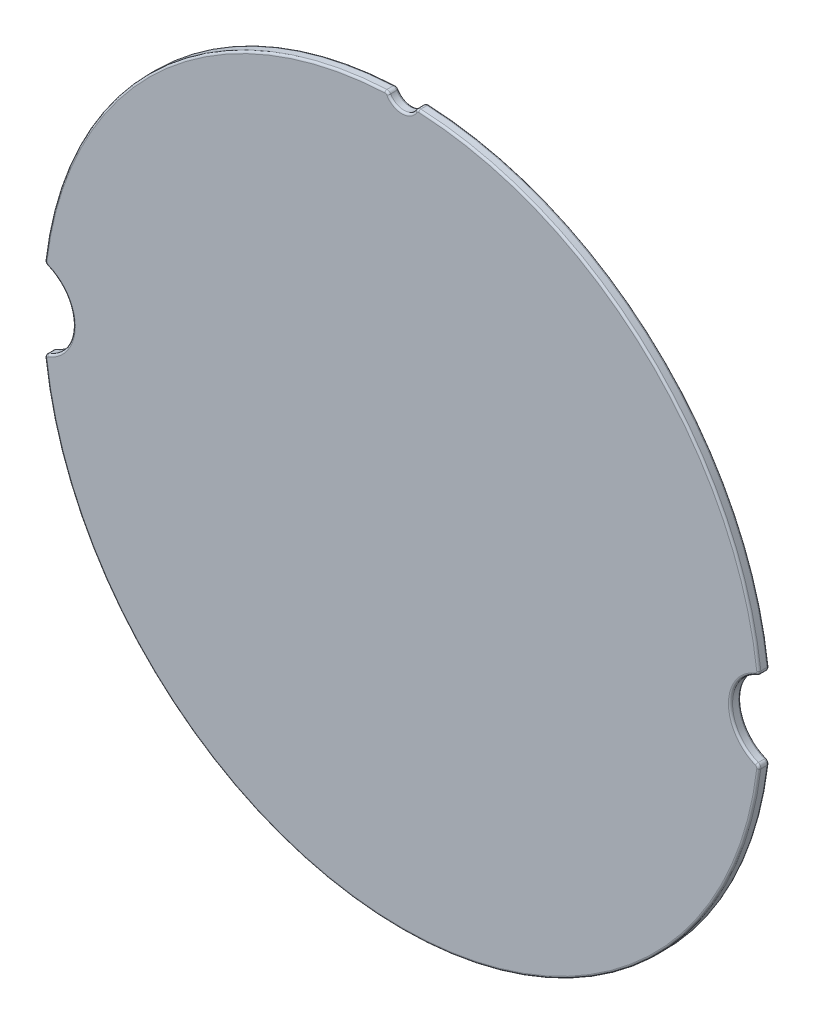
ISO-10303-21;
HEADER;
FILE_DESCRIPTION(('STEP AP214'),'2;1');
FILE_NAME('part.step','',(''),(''),'','','');
FILE_SCHEMA(('AUTOMOTIVE_DESIGN { 1 0 10303 214 1 1 1 1 }'));
ENDSEC;
DATA;
#1=APPLICATION_CONTEXT('core data for automotive mechanical design processes');
#2=APPLICATION_PROTOCOL_DEFINITION('international standard','automotive_design',2000,#1);
#3=PRODUCT_CONTEXT('',#1,'mechanical');
#4=PRODUCT('Part','Part','',(#3));
#5=PRODUCT_RELATED_PRODUCT_CATEGORY('part','',(#4));
#6=PRODUCT_DEFINITION_FORMATION('','',#4);
#7=PRODUCT_DEFINITION_CONTEXT('part definition',#1,'design');
#8=PRODUCT_DEFINITION('design','',#6,#7);
#9=PRODUCT_DEFINITION_SHAPE('','',#8);
#10=(LENGTH_UNIT() NAMED_UNIT(*) SI_UNIT(.MILLI.,.METRE.));
#11=(NAMED_UNIT(*) PLANE_ANGLE_UNIT() SI_UNIT($,.RADIAN.));
#12=(NAMED_UNIT(*) SI_UNIT($,.STERADIAN.) SOLID_ANGLE_UNIT());
#13=UNCERTAINTY_MEASURE_WITH_UNIT(LENGTH_MEASURE(1.E-05),#10,'distance_accuracy_value','');
#14=(GEOMETRIC_REPRESENTATION_CONTEXT(3) GLOBAL_UNCERTAINTY_ASSIGNED_CONTEXT((#13)) GLOBAL_UNIT_ASSIGNED_CONTEXT((#10,
#11,#12)) REPRESENTATION_CONTEXT('',''));
#15=CARTESIAN_POINT('',(0.,0.,0.));
#16=DIRECTION('',(0.,0.,1.));
#17=DIRECTION('',(1.,0.,0.));
#18=AXIS2_PLACEMENT_3D('',#15,#16,#17);
#19=CARTESIAN_POINT('',(0.,0.,-13.5));
#20=DIRECTION('',(0.,0.,1.));
#21=DIRECTION('',(1.,0.,0.));
#22=AXIS2_PLACEMENT_3D('',#19,#20,#21);
#23=CYLINDRICAL_SURFACE('',#22,17.5);
#24=DIRECTION('',(0.,0.,1.));
#25=VECTOR('',#24,1.);
#26=CARTESIAN_POINT('',(0.826653793135384,17.480464625012,-13.5));
#27=LINE('',#26,#25);
#28=CARTESIAN_POINT('',(0.826653793135384,17.480464625012,-13.4));
#29=VERTEX_POINT('',#28);
#30=CARTESIAN_POINT('',(0.826653793135384,17.480464625012,-13.1));
#31=VERTEX_POINT('',#30);
#32=EDGE_CURVE('E271',#29,#31,#27,.T.);
#33=ORIENTED_EDGE('',*,*,#32,.T.);
#34=CARTESIAN_POINT('',(0.,0.,-13.1));
#35=DIRECTION('',(0.,0.,1.));
#36=DIRECTION('',(1.,0.,0.));
#37=AXIS2_PLACEMENT_3D('',#34,#35,#36);
#38=CIRCLE('',#37,17.5);
#39=CARTESIAN_POINT('',(17.3777697495183,2.0647320728672,-13.1));
#40=VERTEX_POINT('',#39);
#41=EDGE_CURVE('E414',#31,#40,#38,.F.);
#42=ORIENTED_EDGE('',*,*,#41,.T.);
#43=DIRECTION('',(0.,0.,1.));
#44=VECTOR('',#43,1.);
#45=CARTESIAN_POINT('',(17.3777697495183,2.0647320728672,-13.5));
#46=LINE('',#45,#44);
#47=CARTESIAN_POINT('',(17.3777697495183,2.0647320728672,-13.4));
#48=VERTEX_POINT('',#47);
#49=EDGE_CURVE('E261',#48,#40,#46,.T.);
#50=ORIENTED_EDGE('',*,*,#49,.F.);
#51=CARTESIAN_POINT('',(0.,0.,-13.4));
#52=DIRECTION('',(0.,0.,1.));
#53=DIRECTION('',(1.,0.,0.));
#54=AXIS2_PLACEMENT_3D('',#51,#52,#53);
#55=CIRCLE('',#54,17.5);
#56=EDGE_CURVE('E311',#48,#29,#55,.T.);
#57=ORIENTED_EDGE('',*,*,#56,.T.);
#58=EDGE_LOOP('',(#33,#42,#50,#57));
#59=FACE_BOUND('',#58,.T.);
#60=ADVANCED_FACE('F41',(#59),#23,.T.);
#61=CARTESIAN_POINT('',(17.1791666666667,2.04113513489157,-13.5));
#62=DIRECTION('',(0.,0.,1.));
#63=DIRECTION('',(1.,0.,0.));
#64=AXIS2_PLACEMENT_3D('',#61,#62,#63);
#65=CYLINDRICAL_SURFACE('',#64,0.200000000000002);
#66=ORIENTED_EDGE('',*,*,#49,.T.);
#67=CARTESIAN_POINT('',(17.1791666666667,2.04113513489157,-13.1));
#68=DIRECTION('',(0.,0.,1.));
#69=DIRECTION('',(1.,0.,0.));
#70=AXIS2_PLACEMENT_3D('',#67,#68,#69);
#71=CIRCLE('',#70,0.200000000000002);
#72=CARTESIAN_POINT('',(17.2537878787879,1.85557739535598,-13.1));
#73=VERTEX_POINT('',#72);
#74=EDGE_CURVE('E408',#40,#73,#71,.F.);
#75=ORIENTED_EDGE('',*,*,#74,.T.);
#76=DIRECTION('',(0.,0.,1.));
#77=VECTOR('',#76,1.);
#78=CARTESIAN_POINT('',(17.2537878787879,1.85557739535598,-13.5));
#79=LINE('',#78,#77);
#80=CARTESIAN_POINT('',(17.2537878787879,1.85557739535598,-13.4));
#81=VERTEX_POINT('',#80);
#82=EDGE_CURVE('E268',#81,#73,#79,.T.);
#83=ORIENTED_EDGE('',*,*,#82,.F.);
#84=CARTESIAN_POINT('',(17.1791666666667,2.04113513489157,-13.4));
#85=DIRECTION('',(0.,0.,1.));
#86=DIRECTION('',(1.,0.,0.));
#87=AXIS2_PLACEMENT_3D('',#84,#85,#86);
#88=CIRCLE('',#87,0.200000000000002);
#89=EDGE_CURVE('E305',#81,#48,#88,.T.);
#90=ORIENTED_EDGE('',*,*,#89,.T.);
#91=EDGE_LOOP('',(#66,#75,#83,#90));
#92=FACE_BOUND('',#91,.T.);
#93=ADVANCED_FACE('F472',(#92),#65,.T.);
#94=CARTESIAN_POINT('',(18.,0.,-13.5));
#95=DIRECTION('',(0.,0.,1.));
#96=DIRECTION('',(1.,0.,0.));
#97=AXIS2_PLACEMENT_3D('',#94,#95,#96);
#98=CYLINDRICAL_SURFACE('',#97,2.);
#99=ORIENTED_EDGE('',*,*,#82,.T.);
#100=CARTESIAN_POINT('',(18.,0.,-13.1));
#101=DIRECTION('',(0.,0.,1.));
#102=DIRECTION('',(1.,0.,0.));
#103=AXIS2_PLACEMENT_3D('',#100,#101,#102);
#104=CIRCLE('',#103,2.);
#105=CARTESIAN_POINT('',(17.2537878787879,-1.85557739535597,-13.1));
#106=VERTEX_POINT('',#105);
#107=EDGE_CURVE('E402',#73,#106,#104,.T.);
#108=ORIENTED_EDGE('',*,*,#107,.T.);
#109=DIRECTION('',(0.,0.,1.));
#110=VECTOR('',#109,1.);
#111=CARTESIAN_POINT('',(17.2537878787879,-1.85557739535597,-13.5));
#112=LINE('',#111,#110);
#113=CARTESIAN_POINT('',(17.2537878787879,-1.85557739535597,-13.4));
#114=VERTEX_POINT('',#113);
#115=EDGE_CURVE('E529',#114,#106,#112,.T.);
#116=ORIENTED_EDGE('',*,*,#115,.F.);
#117=CARTESIAN_POINT('',(18.,0.,-13.4));
#118=DIRECTION('',(0.,0.,1.));
#119=DIRECTION('',(1.,0.,0.));
#120=AXIS2_PLACEMENT_3D('',#117,#118,#119);
#121=CIRCLE('',#120,2.);
#122=EDGE_CURVE('E233',#114,#81,#121,.F.);
#123=ORIENTED_EDGE('',*,*,#122,.T.);
#124=EDGE_LOOP('',(#99,#108,#116,#123));
#125=FACE_BOUND('',#124,.T.);
#126=ADVANCED_FACE('F535',(#125),#98,.F.);
#127=CARTESIAN_POINT('',(17.1791666666667,-2.04113513489157,-13.5));
#128=DIRECTION('',(0.,0.,1.));
#129=DIRECTION('',(1.,0.,0.));
#130=AXIS2_PLACEMENT_3D('',#127,#128,#129);
#131=CYLINDRICAL_SURFACE('',#130,0.200000000000002);
#132=ORIENTED_EDGE('',*,*,#115,.T.);
#133=CARTESIAN_POINT('',(17.1791666666667,-2.04113513489157,-13.1));
#134=DIRECTION('',(0.,0.,1.));
#135=DIRECTION('',(1.,0.,0.));
#136=AXIS2_PLACEMENT_3D('',#133,#134,#135);
#137=CIRCLE('',#136,0.200000000000002);
#138=CARTESIAN_POINT('',(17.3777697495183,-2.0647320728672,-13.1));
#139=VERTEX_POINT('',#138);
#140=EDGE_CURVE('E397',#106,#139,#137,.F.);
#141=ORIENTED_EDGE('',*,*,#140,.T.);
#142=DIRECTION('',(0.,0.,1.));
#143=VECTOR('',#142,1.);
#144=CARTESIAN_POINT('',(17.3777697495183,-2.0647320728672,-13.5));
#145=LINE('',#144,#143);
#146=CARTESIAN_POINT('',(17.3777697495183,-2.0647320728672,-13.4));
#147=VERTEX_POINT('',#146);
#148=EDGE_CURVE('E245',#147,#139,#145,.T.);
#149=ORIENTED_EDGE('',*,*,#148,.F.);
#150=CARTESIAN_POINT('',(17.1791666666667,-2.04113513489157,-13.4));
#151=DIRECTION('',(0.,0.,1.));
#152=DIRECTION('',(1.,0.,0.));
#153=AXIS2_PLACEMENT_3D('',#150,#151,#152);
#154=CIRCLE('',#153,0.200000000000002);
#155=EDGE_CURVE('E234',#147,#114,#154,.T.);
#156=ORIENTED_EDGE('',*,*,#155,.T.);
#157=EDGE_LOOP('',(#132,#141,#149,#156));
#158=FACE_BOUND('',#157,.T.);
#159=ADVANCED_FACE('F551',(#158),#131,.T.);
#160=CARTESIAN_POINT('',(0.,0.,-13.5));
#161=DIRECTION('',(0.,0.,1.));
#162=DIRECTION('',(1.,0.,0.));
#163=AXIS2_PLACEMENT_3D('',#160,#161,#162);
#164=CYLINDRICAL_SURFACE('',#163,17.5);
#165=ORIENTED_EDGE('',*,*,#148,.T.);
#166=CARTESIAN_POINT('',(0.,0.,-13.1));
#167=DIRECTION('',(0.,0.,1.));
#168=DIRECTION('',(1.,0.,0.));
#169=AXIS2_PLACEMENT_3D('',#166,#167,#168);
#170=CIRCLE('',#169,17.5);
#171=CARTESIAN_POINT('',(-17.3777697495183,-2.0647320728672,-13.1));
#172=VERTEX_POINT('',#171);
#173=EDGE_CURVE('E244',#139,#172,#170,.F.);
#174=ORIENTED_EDGE('',*,*,#173,.T.);
#175=DIRECTION('',(0.,0.,1.));
#176=VECTOR('',#175,1.);
#177=CARTESIAN_POINT('',(-17.3777697495183,-2.0647320728672,-13.5));
#178=LINE('',#177,#176);
#179=CARTESIAN_POINT('',(-17.3777697495183,-2.0647320728672,-13.4));
#180=VERTEX_POINT('',#179);
#181=EDGE_CURVE('E225',#180,#172,#178,.T.);
#182=ORIENTED_EDGE('',*,*,#181,.F.);
#183=CARTESIAN_POINT('',(0.,0.,-13.4));
#184=DIRECTION('',(0.,0.,1.));
#185=DIRECTION('',(1.,0.,0.));
#186=AXIS2_PLACEMENT_3D('',#183,#184,#185);
#187=CIRCLE('',#186,17.5);
#188=EDGE_CURVE('E241',#180,#147,#187,.T.);
#189=ORIENTED_EDGE('',*,*,#188,.T.);
#190=EDGE_LOOP('',(#165,#174,#182,#189));
#191=FACE_BOUND('',#190,.T.);
#192=ADVANCED_FACE('F239',(#191),#164,.T.);
#193=CARTESIAN_POINT('',(-17.1791666666667,-2.04113513489158,-13.5));
#194=DIRECTION('',(0.,0.,1.));
#195=DIRECTION('',(1.,0.,0.));
#196=AXIS2_PLACEMENT_3D('',#193,#194,#195);
#197=CYLINDRICAL_SURFACE('',#196,0.200000000000002);
#198=ORIENTED_EDGE('',*,*,#181,.T.);
#199=CARTESIAN_POINT('',(-17.1791666666667,-2.04113513489158,-13.1));
#200=DIRECTION('',(0.,0.,1.));
#201=DIRECTION('',(1.,0.,0.));
#202=AXIS2_PLACEMENT_3D('',#199,#200,#201);
#203=CIRCLE('',#202,0.200000000000002);
#204=CARTESIAN_POINT('',(-17.2537878787879,-1.85557739535598,-13.1));
#205=VERTEX_POINT('',#204);
#206=EDGE_CURVE('E391',#172,#205,#203,.F.);
#207=ORIENTED_EDGE('',*,*,#206,.T.);
#208=DIRECTION('',(0.,0.,1.));
#209=VECTOR('',#208,1.);
#210=CARTESIAN_POINT('',(-17.2537878787879,-1.85557739535598,-13.5));
#211=LINE('',#210,#209);
#212=CARTESIAN_POINT('',(-17.2537878787879,-1.85557739535598,-13.4));
#213=VERTEX_POINT('',#212);
#214=EDGE_CURVE('E228',#213,#205,#211,.T.);
#215=ORIENTED_EDGE('',*,*,#214,.F.);
#216=CARTESIAN_POINT('',(-17.1791666666667,-2.04113513489158,-13.4));
#217=DIRECTION('',(0.,0.,1.));
#218=DIRECTION('',(1.,0.,0.));
#219=AXIS2_PLACEMENT_3D('',#216,#217,#218);
#220=CIRCLE('',#219,0.200000000000002);
#221=EDGE_CURVE('E221',#213,#180,#220,.T.);
#222=ORIENTED_EDGE('',*,*,#221,.T.);
#223=EDGE_LOOP('',(#198,#207,#215,#222));
#224=FACE_BOUND('',#223,.T.);
#225=ADVANCED_FACE('F223',(#224),#197,.T.);
#226=CARTESIAN_POINT('',(-18.,0.,-13.5));
#227=DIRECTION('',(0.,0.,1.));
#228=DIRECTION('',(1.,0.,0.));
#229=AXIS2_PLACEMENT_3D('',#226,#227,#228);
#230=CYLINDRICAL_SURFACE('',#229,2.);
#231=ORIENTED_EDGE('',*,*,#214,.T.);
#232=CARTESIAN_POINT('',(-18.,0.,-13.1));
#233=DIRECTION('',(0.,0.,1.));
#234=DIRECTION('',(1.,0.,0.));
#235=AXIS2_PLACEMENT_3D('',#232,#233,#234);
#236=CIRCLE('',#235,2.);
#237=CARTESIAN_POINT('',(-17.2537878787879,1.85557739535597,-13.1));
#238=VERTEX_POINT('',#237);
#239=EDGE_CURVE('E394',#205,#238,#236,.T.);
#240=ORIENTED_EDGE('',*,*,#239,.T.);
#241=DIRECTION('',(0.,0.,1.));
#242=VECTOR('',#241,1.);
#243=CARTESIAN_POINT('',(-17.2537878787879,1.85557739535597,-13.5));
#244=LINE('',#243,#242);
#245=CARTESIAN_POINT('',(-17.2537878787879,1.85557739535597,-13.4));
#246=VERTEX_POINT('',#245);
#247=EDGE_CURVE('E523',#246,#238,#244,.T.);
#248=ORIENTED_EDGE('',*,*,#247,.F.);
#249=CARTESIAN_POINT('',(-18.,0.,-13.4));
#250=DIRECTION('',(0.,0.,1.));
#251=DIRECTION('',(1.,0.,0.));
#252=AXIS2_PLACEMENT_3D('',#249,#250,#251);
#253=CIRCLE('',#252,2.);
#254=EDGE_CURVE('E302',#246,#213,#253,.F.);
#255=ORIENTED_EDGE('',*,*,#254,.T.);
#256=EDGE_LOOP('',(#231,#240,#248,#255));
#257=FACE_BOUND('',#256,.T.);
#258=ADVANCED_FACE('F582',(#257),#230,.F.);
#259=CARTESIAN_POINT('',(-17.1791666666667,2.04113513489157,-13.5));
#260=DIRECTION('',(0.,0.,1.));
#261=DIRECTION('',(1.,0.,0.));
#262=AXIS2_PLACEMENT_3D('',#259,#260,#261);
#263=CYLINDRICAL_SURFACE('',#262,0.200000000000002);
#264=ORIENTED_EDGE('',*,*,#247,.T.);
#265=CARTESIAN_POINT('',(-17.1791666666667,2.04113513489157,-13.1));
#266=DIRECTION('',(0.,0.,1.));
#267=DIRECTION('',(1.,0.,0.));
#268=AXIS2_PLACEMENT_3D('',#265,#266,#267);
#269=CIRCLE('',#268,0.200000000000002);
#270=CARTESIAN_POINT('',(-17.3777697495183,2.0647320728672,-13.1));
#271=VERTEX_POINT('',#270);
#272=EDGE_CURVE('E399',#238,#271,#269,.F.);
#273=ORIENTED_EDGE('',*,*,#272,.T.);
#274=DIRECTION('',(0.,0.,1.));
#275=VECTOR('',#274,1.);
#276=CARTESIAN_POINT('',(-17.3777697495183,2.0647320728672,-13.5));
#277=LINE('',#276,#275);
#278=CARTESIAN_POINT('',(-17.3777697495183,2.0647320728672,-13.4));
#279=VERTEX_POINT('',#278);
#280=EDGE_CURVE('E518',#279,#271,#277,.T.);
#281=ORIENTED_EDGE('',*,*,#280,.F.);
#282=CARTESIAN_POINT('',(-17.1791666666667,2.04113513489157,-13.4));
#283=DIRECTION('',(0.,0.,1.));
#284=DIRECTION('',(1.,0.,0.));
#285=AXIS2_PLACEMENT_3D('',#282,#283,#284);
#286=CIRCLE('',#285,0.200000000000002);
#287=EDGE_CURVE('E308',#279,#246,#286,.T.);
#288=ORIENTED_EDGE('',*,*,#287,.T.);
#289=EDGE_LOOP('',(#264,#273,#281,#288));
#290=FACE_BOUND('',#289,.T.);
#291=ADVANCED_FACE('F578',(#290),#263,.T.);
#292=CARTESIAN_POINT('',(0.,0.,-13.5));
#293=DIRECTION('',(0.,0.,1.));
#294=DIRECTION('',(1.,0.,0.));
#295=AXIS2_PLACEMENT_3D('',#292,#293,#294);
#296=CYLINDRICAL_SURFACE('',#295,17.5);
#297=ORIENTED_EDGE('',*,*,#280,.T.);
#298=CARTESIAN_POINT('',(0.,0.,-13.1));
#299=DIRECTION('',(0.,0.,1.));
#300=DIRECTION('',(1.,0.,0.));
#301=AXIS2_PLACEMENT_3D('',#298,#299,#300);
#302=CIRCLE('',#301,17.5);
#303=CARTESIAN_POINT('',(-0.826653793135391,17.480464625012,-13.1));
#304=VERTEX_POINT('',#303);
#305=EDGE_CURVE('E405',#271,#304,#302,.F.);
#306=ORIENTED_EDGE('',*,*,#305,.T.);
#307=DIRECTION('',(0.,0.,1.));
#308=VECTOR('',#307,1.);
#309=CARTESIAN_POINT('',(-0.826653793135391,17.480464625012,-13.5));
#310=LINE('',#309,#308);
#311=CARTESIAN_POINT('',(-0.826653793135391,17.480464625012,-13.4));
#312=VERTEX_POINT('',#311);
#313=EDGE_CURVE('E515',#312,#304,#310,.T.);
#314=ORIENTED_EDGE('',*,*,#313,.F.);
#315=CARTESIAN_POINT('',(0.,0.,-13.4));
#316=DIRECTION('',(0.,0.,1.));
#317=DIRECTION('',(1.,0.,0.));
#318=AXIS2_PLACEMENT_3D('',#315,#316,#317);
#319=CIRCLE('',#318,17.5);
#320=EDGE_CURVE('E314',#312,#279,#319,.T.);
#321=ORIENTED_EDGE('',*,*,#320,.T.);
#322=EDGE_LOOP('',(#297,#306,#314,#321));
#323=FACE_BOUND('',#322,.T.);
#324=ADVANCED_FACE('F575',(#323),#296,.T.);
#325=CARTESIAN_POINT('',(-0.817206321213843,17.2806878864404,-13.5));
#326=DIRECTION('',(0.,0.,1.));
#327=DIRECTION('',(1.,0.,0.));
#328=AXIS2_PLACEMENT_3D('',#325,#326,#327);
#329=CYLINDRICAL_SURFACE('',#328,0.200000000000002);
#330=ORIENTED_EDGE('',*,*,#313,.T.);
#331=CARTESIAN_POINT('',(-0.817206321213843,17.2806878864404,-13.1));
#332=DIRECTION('',(0.,0.,1.));
#333=DIRECTION('',(1.,0.,0.));
#334=AXIS2_PLACEMENT_3D('',#331,#332,#333);
#335=CIRCLE('',#334,0.200000000000002);
#336=CARTESIAN_POINT('',(-0.645162885168822,17.3826734546048,-13.1));
#337=VERTEX_POINT('',#336);
#338=EDGE_CURVE('E411',#304,#337,#335,.F.);
#339=ORIENTED_EDGE('',*,*,#338,.T.);
#340=DIRECTION('',(0.,0.,1.));
#341=VECTOR('',#340,1.);
#342=CARTESIAN_POINT('',(-0.645162885168822,17.3826734546048,-13.5));
#343=LINE('',#342,#341);
#344=CARTESIAN_POINT('',(-0.645162885168822,17.3826734546048,-13.4));
#345=VERTEX_POINT('',#344);
#346=EDGE_CURVE('E508',#345,#337,#343,.T.);
#347=ORIENTED_EDGE('',*,*,#346,.F.);
#348=CARTESIAN_POINT('',(-0.817206321213843,17.2806878864404,-13.4));
#349=DIRECTION('',(0.,0.,1.));
#350=DIRECTION('',(1.,0.,0.));
#351=AXIS2_PLACEMENT_3D('',#348,#349,#350);
#352=CIRCLE('',#351,0.200000000000002);
#353=EDGE_CURVE('E319',#345,#312,#352,.T.);
#354=ORIENTED_EDGE('',*,*,#353,.T.);
#355=EDGE_LOOP('',(#330,#339,#347,#354));
#356=FACE_BOUND('',#355,.T.);
#357=ADVANCED_FACE('F511',(#356),#329,.T.);
#358=CARTESIAN_POINT('',(0.,17.7651193352215,-13.5));
#359=DIRECTION('',(0.,0.,1.));
#360=DIRECTION('',(1.,0.,0.));
#361=AXIS2_PLACEMENT_3D('',#358,#359,#360);
#362=CYLINDRICAL_SURFACE('',#361,0.75);
#363=ORIENTED_EDGE('',*,*,#346,.T.);
#364=CARTESIAN_POINT('',(0.,17.7651193352215,-13.1));
#365=DIRECTION('',(0.,0.,1.));
#366=DIRECTION('',(1.,0.,0.));
#367=AXIS2_PLACEMENT_3D('',#364,#365,#366);
#368=CIRCLE('',#367,0.75);
#369=CARTESIAN_POINT('',(0.645162885168815,17.3826734546048,-13.1));
#370=VERTEX_POINT('',#369);
#371=EDGE_CURVE('E50',#337,#370,#368,.T.);
#372=ORIENTED_EDGE('',*,*,#371,.T.);
#373=DIRECTION('',(0.,0.,1.));
#374=VECTOR('',#373,1.);
#375=CARTESIAN_POINT('',(0.645162885168815,17.3826734546048,-13.5));
#376=LINE('',#375,#374);
#377=CARTESIAN_POINT('',(0.645162885168815,17.3826734546048,-13.4));
#378=VERTEX_POINT('',#377);
#379=EDGE_CURVE('E496',#378,#370,#376,.T.);
#380=ORIENTED_EDGE('',*,*,#379,.F.);
#381=CARTESIAN_POINT('',(0.,17.7651193352215,-13.4));
#382=DIRECTION('',(0.,0.,1.));
#383=DIRECTION('',(1.,0.,0.));
#384=AXIS2_PLACEMENT_3D('',#381,#382,#383);
#385=CIRCLE('',#384,0.75);
#386=EDGE_CURVE('E322',#378,#345,#385,.F.);
#387=ORIENTED_EDGE('',*,*,#386,.T.);
#388=EDGE_LOOP('',(#363,#372,#380,#387));
#389=FACE_BOUND('',#388,.T.);
#390=ADVANCED_FACE('F507',(#389),#362,.F.);
#391=CARTESIAN_POINT('',(0.817206321213837,17.2806878864404,-13.5));
#392=DIRECTION('',(0.,0.,1.));
#393=DIRECTION('',(1.,0.,0.));
#394=AXIS2_PLACEMENT_3D('',#391,#392,#393);
#395=CYLINDRICAL_SURFACE('',#394,0.200000000000004);
#396=ORIENTED_EDGE('',*,*,#379,.T.);
#397=CARTESIAN_POINT('',(0.817206321213837,17.2806878864404,-13.1));
#398=DIRECTION('',(0.,0.,1.));
#399=DIRECTION('',(1.,0.,0.));
#400=AXIS2_PLACEMENT_3D('',#397,#398,#399);
#401=CIRCLE('',#400,0.200000000000004);
#402=EDGE_CURVE('E11',#370,#31,#401,.F.);
#403=ORIENTED_EDGE('',*,*,#402,.T.);
#404=ORIENTED_EDGE('',*,*,#32,.F.);
#405=CARTESIAN_POINT('',(0.817206321213837,17.2806878864404,-13.4));
#406=DIRECTION('',(0.,0.,1.));
#407=DIRECTION('',(1.,0.,0.));
#408=AXIS2_PLACEMENT_3D('',#405,#406,#407);
#409=CIRCLE('',#408,0.200000000000004);
#410=EDGE_CURVE('E317',#29,#378,#409,.T.);
#411=ORIENTED_EDGE('',*,*,#410,.T.);
#412=EDGE_LOOP('',(#396,#403,#404,#411));
#413=FACE_BOUND('',#412,.T.);
#414=ADVANCED_FACE('F495',(#413),#395,.T.);
#415=CARTESIAN_POINT('',(0.408603160606918,8.6403439432202,-13.5));
#416=DIRECTION('',(0.,0.,1.));
#417=DIRECTION('',(1.,0.,0.));
#418=AXIS2_PLACEMENT_3D('',#415,#416,#417);
#419=PLANE('',#418);
#420=CARTESIAN_POINT('',(17.1791666666667,-2.04113513489157,-13.5));
#421=DIRECTION('',(0.,0.,1.));
#422=DIRECTION('',(1.,0.,0.));
#423=AXIS2_PLACEMENT_3D('',#420,#421,#422);
#424=CIRCLE('',#423,0.100000000000001);
#425=CARTESIAN_POINT('',(17.2164772727273,-1.94835626512377,-13.5));
#426=VERTEX_POINT('',#425);
#427=CARTESIAN_POINT('',(17.2784682080925,-2.05293360387938,-13.5));
#428=VERTEX_POINT('',#427);
#429=EDGE_CURVE('E295',#426,#428,#424,.F.);
#430=ORIENTED_EDGE('',*,*,#429,.T.);
#431=CARTESIAN_POINT('',(0.,0.,-13.5));
#432=DIRECTION('',(0.,0.,1.));
#433=DIRECTION('',(1.,0.,0.));
#434=AXIS2_PLACEMENT_3D('',#431,#432,#433);
#435=CIRCLE('',#434,17.4);
#436=CARTESIAN_POINT('',(-17.2784682080925,-2.05293360387939,-13.5));
#437=VERTEX_POINT('',#436);
#438=EDGE_CURVE('E297',#428,#437,#435,.F.);
#439=ORIENTED_EDGE('',*,*,#438,.T.);
#440=CARTESIAN_POINT('',(-17.1791666666667,-2.04113513489158,-13.5));
#441=DIRECTION('',(0.,0.,1.));
#442=DIRECTION('',(1.,0.,0.));
#443=AXIS2_PLACEMENT_3D('',#440,#441,#442);
#444=CIRCLE('',#443,0.100000000000001);
#445=CARTESIAN_POINT('',(-17.2164772727273,-1.94835626512378,-13.5));
#446=VERTEX_POINT('',#445);
#447=EDGE_CURVE('E250',#437,#446,#444,.F.);
#448=ORIENTED_EDGE('',*,*,#447,.T.);
#449=CARTESIAN_POINT('',(-18.,0.,-13.5));
#450=DIRECTION('',(0.,0.,1.));
#451=DIRECTION('',(1.,0.,0.));
#452=AXIS2_PLACEMENT_3D('',#449,#450,#451);
#453=CIRCLE('',#452,2.1);
#454=CARTESIAN_POINT('',(-17.2164772727273,1.94835626512377,-13.5));
#455=VERTEX_POINT('',#454);
#456=EDGE_CURVE('E288',#446,#455,#453,.T.);
#457=ORIENTED_EDGE('',*,*,#456,.T.);
#458=CARTESIAN_POINT('',(-17.1791666666667,2.04113513489157,-13.5));
#459=DIRECTION('',(0.,0.,1.));
#460=DIRECTION('',(1.,0.,0.));
#461=AXIS2_PLACEMENT_3D('',#458,#459,#460);
#462=CIRCLE('',#461,0.100000000000001);
#463=CARTESIAN_POINT('',(-17.2784682080925,2.05293360387938,-13.5));
#464=VERTEX_POINT('',#463);
#465=EDGE_CURVE('E284',#455,#464,#462,.F.);
#466=ORIENTED_EDGE('',*,*,#465,.T.);
#467=CARTESIAN_POINT('',(0.,0.,-13.5));
#468=DIRECTION('',(0.,0.,1.));
#469=DIRECTION('',(1.,0.,0.));
#470=AXIS2_PLACEMENT_3D('',#467,#468,#469);
#471=CIRCLE('',#470,17.4);
#472=CARTESIAN_POINT('',(-0.821930057174617,17.3805762557262,-13.5));
#473=VERTEX_POINT('',#472);
#474=EDGE_CURVE('E278',#464,#473,#471,.F.);
#475=ORIENTED_EDGE('',*,*,#474,.T.);
#476=CARTESIAN_POINT('',(-0.817206321213843,17.2806878864404,-13.5));
#477=DIRECTION('',(0.,0.,1.));
#478=DIRECTION('',(1.,0.,0.));
#479=AXIS2_PLACEMENT_3D('',#476,#477,#478);
#480=CIRCLE('',#479,0.100000000000001);
#481=CARTESIAN_POINT('',(-0.731184603191334,17.3316806705226,-13.5));
#482=VERTEX_POINT('',#481);
#483=EDGE_CURVE('E264',#473,#482,#480,.F.);
#484=ORIENTED_EDGE('',*,*,#483,.T.);
#485=CARTESIAN_POINT('',(0.,17.7651193352215,-13.5));
#486=DIRECTION('',(0.,0.,1.));
#487=DIRECTION('',(1.,0.,0.));
#488=AXIS2_PLACEMENT_3D('',#485,#486,#487);
#489=CIRCLE('',#488,0.850000000000002);
#490=CARTESIAN_POINT('',(0.731184603191326,17.3316806705226,-13.5));
#491=VERTEX_POINT('',#490);
#492=EDGE_CURVE('E260',#482,#491,#489,.T.);
#493=ORIENTED_EDGE('',*,*,#492,.T.);
#494=CARTESIAN_POINT('',(0.817206321213837,17.2806878864404,-13.5));
#495=DIRECTION('',(0.,0.,1.));
#496=DIRECTION('',(1.,0.,0.));
#497=AXIS2_PLACEMENT_3D('',#494,#495,#496);
#498=CIRCLE('',#497,0.100000000000003);
#499=CARTESIAN_POINT('',(0.821930057174611,17.3805762557262,-13.5));
#500=VERTEX_POINT('',#499);
#501=EDGE_CURVE('E276',#491,#500,#498,.F.);
#502=ORIENTED_EDGE('',*,*,#501,.T.);
#503=CARTESIAN_POINT('',(0.,0.,-13.5));
#504=DIRECTION('',(0.,0.,1.));
#505=DIRECTION('',(1.,0.,0.));
#506=AXIS2_PLACEMENT_3D('',#503,#504,#505);
#507=CIRCLE('',#506,17.4);
#508=CARTESIAN_POINT('',(17.2784682080925,2.05293360387939,-13.5));
#509=VERTEX_POINT('',#508);
#510=EDGE_CURVE('E281',#500,#509,#507,.F.);
#511=ORIENTED_EDGE('',*,*,#510,.T.);
#512=CARTESIAN_POINT('',(17.1791666666667,2.04113513489157,-13.5));
#513=DIRECTION('',(0.,0.,1.));
#514=DIRECTION('',(1.,0.,0.));
#515=AXIS2_PLACEMENT_3D('',#512,#513,#514);
#516=CIRCLE('',#515,0.100000000000001);
#517=CARTESIAN_POINT('',(17.2164772727273,1.94835626512377,-13.5));
#518=VERTEX_POINT('',#517);
#519=EDGE_CURVE('E286',#509,#518,#516,.F.);
#520=ORIENTED_EDGE('',*,*,#519,.T.);
#521=CARTESIAN_POINT('',(18.,0.,-13.5));
#522=DIRECTION('',(0.,0.,1.));
#523=DIRECTION('',(1.,0.,0.));
#524=AXIS2_PLACEMENT_3D('',#521,#522,#523);
#525=CIRCLE('',#524,2.1);
#526=EDGE_CURVE('E291',#518,#426,#525,.T.);
#527=ORIENTED_EDGE('',*,*,#526,.T.);
#528=EDGE_LOOP('',(#430,#439,#448,#457,#466,#475,#484,#493,#502,#511,#520,#527));
#529=FACE_BOUND('',#528,.T.);
#530=ADVANCED_FACE('F488',(#529),#419,.F.);
#531=CARTESIAN_POINT('',(0.408603160606918,8.6403439432202,-13.));
#532=DIRECTION('',(0.,0.,1.));
#533=DIRECTION('',(1.,0.,0.));
#534=AXIS2_PLACEMENT_3D('',#531,#532,#533);
#535=PLANE('',#534);
#536=CARTESIAN_POINT('',(-18.,0.,-13.));
#537=DIRECTION('',(0.,0.,1.));
#538=DIRECTION('',(1.,0.,0.));
#539=AXIS2_PLACEMENT_3D('',#536,#537,#538);
#540=CIRCLE('',#539,2.1);
#541=CARTESIAN_POINT('',(-17.2164772727273,1.94835626512377,-13.));
#542=VERTEX_POINT('',#541);
#543=CARTESIAN_POINT('',(-17.2164772727273,-1.94835626512378,-13.));
#544=VERTEX_POINT('',#543);
#545=EDGE_CURVE('E383',#542,#544,#540,.F.);
#546=ORIENTED_EDGE('',*,*,#545,.T.);
#547=CARTESIAN_POINT('',(-17.1791666666667,-2.04113513489158,-13.));
#548=DIRECTION('',(0.,0.,1.));
#549=DIRECTION('',(1.,0.,0.));
#550=AXIS2_PLACEMENT_3D('',#547,#548,#549);
#551=CIRCLE('',#550,0.0999999999999968);
#552=CARTESIAN_POINT('',(-17.2784682080925,-2.05293360387939,-13.));
#553=VERTEX_POINT('',#552);
#554=EDGE_CURVE('E388',#544,#553,#551,.T.);
#555=ORIENTED_EDGE('',*,*,#554,.T.);
#556=CARTESIAN_POINT('',(0.,0.,-13.));
#557=DIRECTION('',(0.,0.,1.));
#558=DIRECTION('',(1.,0.,0.));
#559=AXIS2_PLACEMENT_3D('',#556,#557,#558);
#560=CIRCLE('',#559,17.4);
#561=CARTESIAN_POINT('',(17.2784682080925,-2.05293360387938,-13.));
#562=VERTEX_POINT('',#561);
#563=EDGE_CURVE('E386',#553,#562,#560,.T.);
#564=ORIENTED_EDGE('',*,*,#563,.T.);
#565=CARTESIAN_POINT('',(17.1791666666667,-2.04113513489157,-13.));
#566=DIRECTION('',(0.,0.,1.));
#567=DIRECTION('',(1.,0.,0.));
#568=AXIS2_PLACEMENT_3D('',#565,#566,#567);
#569=CIRCLE('',#568,0.0999999999999968);
#570=CARTESIAN_POINT('',(17.2164772727273,-1.94835626512377,-13.));
#571=VERTEX_POINT('',#570);
#572=EDGE_CURVE('E381',#562,#571,#569,.T.);
#573=ORIENTED_EDGE('',*,*,#572,.T.);
#574=CARTESIAN_POINT('',(18.,0.,-13.));
#575=DIRECTION('',(0.,0.,1.));
#576=DIRECTION('',(1.,0.,0.));
#577=AXIS2_PLACEMENT_3D('',#574,#575,#576);
#578=CIRCLE('',#577,2.1);
#579=CARTESIAN_POINT('',(17.2164772727273,1.94835626512378,-13.));
#580=VERTEX_POINT('',#579);
#581=EDGE_CURVE('E375',#571,#580,#578,.F.);
#582=ORIENTED_EDGE('',*,*,#581,.T.);
#583=CARTESIAN_POINT('',(17.1791666666667,2.04113513489157,-13.));
#584=DIRECTION('',(0.,0.,1.));
#585=DIRECTION('',(1.,0.,0.));
#586=AXIS2_PLACEMENT_3D('',#583,#584,#585);
#587=CIRCLE('',#586,0.0999999999999965);
#588=CARTESIAN_POINT('',(17.2784682080925,2.05293360387939,-13.));
#589=VERTEX_POINT('',#588);
#590=EDGE_CURVE('E369',#580,#589,#587,.T.);
#591=ORIENTED_EDGE('',*,*,#590,.T.);
#592=CARTESIAN_POINT('',(0.,0.,-13.));
#593=DIRECTION('',(0.,0.,1.));
#594=DIRECTION('',(1.,0.,0.));
#595=AXIS2_PLACEMENT_3D('',#592,#593,#594);
#596=CIRCLE('',#595,17.4);
#597=CARTESIAN_POINT('',(0.82193005717461,17.3805762557262,-13.));
#598=VERTEX_POINT('',#597);
#599=EDGE_CURVE('E363',#589,#598,#596,.T.);
#600=ORIENTED_EDGE('',*,*,#599,.T.);
#601=CARTESIAN_POINT('',(0.817206321213837,17.2806878864404,-13.));
#602=DIRECTION('',(0.,0.,1.));
#603=DIRECTION('',(1.,0.,0.));
#604=AXIS2_PLACEMENT_3D('',#601,#602,#603);
#605=CIRCLE('',#604,0.0999999999999989);
#606=CARTESIAN_POINT('',(0.731184603191328,17.3316806705226,-13.));
#607=VERTEX_POINT('',#606);
#608=EDGE_CURVE('E325',#598,#607,#605,.T.);
#609=ORIENTED_EDGE('',*,*,#608,.T.);
#610=CARTESIAN_POINT('',(0.,17.7651193352215,-13.));
#611=DIRECTION('',(0.,0.,1.));
#612=DIRECTION('',(1.,0.,0.));
#613=AXIS2_PLACEMENT_3D('',#610,#611,#612);
#614=CIRCLE('',#613,0.850000000000006);
#615=CARTESIAN_POINT('',(-0.731184603191336,17.3316806705226,-13.));
#616=VERTEX_POINT('',#615);
#617=EDGE_CURVE('E360',#607,#616,#614,.F.);
#618=ORIENTED_EDGE('',*,*,#617,.T.);
#619=CARTESIAN_POINT('',(-0.817206321213843,17.2806878864404,-13.));
#620=DIRECTION('',(0.,0.,1.));
#621=DIRECTION('',(1.,0.,0.));
#622=AXIS2_PLACEMENT_3D('',#619,#620,#621);
#623=CIRCLE('',#622,0.0999999999999971);
#624=CARTESIAN_POINT('',(-0.821930057174617,17.3805762557262,-13.));
#625=VERTEX_POINT('',#624);
#626=EDGE_CURVE('E366',#616,#625,#623,.T.);
#627=ORIENTED_EDGE('',*,*,#626,.T.);
#628=CARTESIAN_POINT('',(0.,0.,-13.));
#629=DIRECTION('',(0.,0.,1.));
#630=DIRECTION('',(1.,0.,0.));
#631=AXIS2_PLACEMENT_3D('',#628,#629,#630);
#632=CIRCLE('',#631,17.4);
#633=CARTESIAN_POINT('',(-17.2784682080925,2.05293360387938,-13.));
#634=VERTEX_POINT('',#633);
#635=EDGE_CURVE('E372',#625,#634,#632,.T.);
#636=ORIENTED_EDGE('',*,*,#635,.T.);
#637=CARTESIAN_POINT('',(-17.1791666666667,2.04113513489157,-13.));
#638=DIRECTION('',(0.,0.,1.));
#639=DIRECTION('',(1.,0.,0.));
#640=AXIS2_PLACEMENT_3D('',#637,#638,#639);
#641=CIRCLE('',#640,0.0999999999999965);
#642=EDGE_CURVE('E378',#634,#542,#641,.T.);
#643=ORIENTED_EDGE('',*,*,#642,.T.);
#644=EDGE_LOOP('',(#546,#555,#564,#573,#582,#591,#600,#609,#618,#627,#636,#643));
#645=FACE_BOUND('',#644,.T.);
#646=ADVANCED_FACE('F595',(#645),#535,.T.);
#647=CARTESIAN_POINT('',(0.,17.7651193352215,-13.4));
#648=DIRECTION('',(0.,0.,1.));
#649=DIRECTION('',(1.,0.,0.));
#650=AXIS2_PLACEMENT_3D('',#647,#648,#649);
#651=TOROIDAL_SURFACE('',#650,0.850000000000002,0.100000000000001);
#652=CARTESIAN_POINT('',(0.731184603191326,17.3316806705226,-13.4));
#653=DIRECTION('',(0.509927840822185,0.860217180225102,0.));
#654=DIRECTION('',(-0.860217180225102,0.509927840822185,0.));
#655=AXIS2_PLACEMENT_3D('',#652,#653,#654);
#656=CIRCLE('',#655,0.100000000000001);
#657=EDGE_CURVE('E352',#491,#378,#656,.T.);
#658=ORIENTED_EDGE('',*,*,#657,.F.);
#659=ORIENTED_EDGE('',*,*,#492,.F.);
#660=CARTESIAN_POINT('',(-0.731184603191333,17.3316806705226,-13.4));
#661=DIRECTION('',(-0.509927840822188,0.860217180225099,0.));
#662=DIRECTION('',(-0.860217180225099,-0.509927840822188,0.));
#663=AXIS2_PLACEMENT_3D('',#660,#661,#662);
#664=CIRCLE('',#663,0.100000000000001);
#665=EDGE_CURVE('E355',#345,#482,#664,.T.);
#666=ORIENTED_EDGE('',*,*,#665,.F.);
#667=ORIENTED_EDGE('',*,*,#386,.F.);
#668=EDGE_LOOP('',(#658,#659,#666,#667));
#669=FACE_BOUND('',#668,.T.);
#670=ADVANCED_FACE('F503',(#669),#651,.T.);
#671=CARTESIAN_POINT('',(-0.817206321213843,17.2806878864404,-13.4));
#672=DIRECTION('',(0.,0.,1.));
#673=DIRECTION('',(1.,0.,0.));
#674=AXIS2_PLACEMENT_3D('',#671,#672,#673);
#675=TOROIDAL_SURFACE('',#674,0.100000000000001,0.100000000000001);
#676=ORIENTED_EDGE('',*,*,#665,.T.);
#677=ORIENTED_EDGE('',*,*,#483,.F.);
#678=CARTESIAN_POINT('',(-0.821930057174617,17.3805762557262,-13.4));
#679=DIRECTION('',(-0.998883692857827,-0.0472373596077363,0.));
#680=DIRECTION('',(0.0472373596077363,-0.998883692857827,0.));
#681=AXIS2_PLACEMENT_3D('',#678,#679,#680);
#682=CIRCLE('',#681,0.100000000000001);
#683=EDGE_CURVE('E348',#312,#473,#682,.T.);
#684=ORIENTED_EDGE('',*,*,#683,.F.);
#685=ORIENTED_EDGE('',*,*,#353,.F.);
#686=EDGE_LOOP('',(#676,#677,#684,#685));
#687=FACE_BOUND('',#686,.T.);
#688=ADVANCED_FACE('F616',(#687),#675,.T.);
#689=CARTESIAN_POINT('',(0.817206321213837,17.2806878864404,-13.4));
#690=DIRECTION('',(0.,0.,1.));
#691=DIRECTION('',(1.,0.,0.));
#692=AXIS2_PLACEMENT_3D('',#689,#690,#691);
#693=TOROIDAL_SURFACE('',#692,0.100000000000003,0.100000000000001);
#694=ORIENTED_EDGE('',*,*,#657,.T.);
#695=ORIENTED_EDGE('',*,*,#410,.F.);
#696=CARTESIAN_POINT('',(0.821930057174611,17.3805762557262,-13.4));
#697=DIRECTION('',(0.998883692857827,-0.0472373596077352,0.));
#698=DIRECTION('',(0.0472373596077353,0.998883692857827,0.));
#699=AXIS2_PLACEMENT_3D('',#696,#697,#698);
#700=CIRCLE('',#699,0.100000000000001);
#701=EDGE_CURVE('E345',#500,#29,#700,.T.);
#702=ORIENTED_EDGE('',*,*,#701,.F.);
#703=ORIENTED_EDGE('',*,*,#501,.F.);
#704=EDGE_LOOP('',(#694,#695,#702,#703));
#705=FACE_BOUND('',#704,.T.);
#706=ADVANCED_FACE('F498',(#705),#693,.T.);
#707=CARTESIAN_POINT('',(0.,0.,-13.4));
#708=DIRECTION('',(0.,0.,1.));
#709=DIRECTION('',(1.,0.,0.));
#710=AXIS2_PLACEMENT_3D('',#707,#708,#709);
#711=TOROIDAL_SURFACE('',#710,17.4,0.100000000000001);
#712=ORIENTED_EDGE('',*,*,#683,.T.);
#713=ORIENTED_EDGE('',*,*,#474,.F.);
#714=CARTESIAN_POINT('',(-17.2784682080925,2.05293360387938,-13.4));
#715=DIRECTION('',(-0.117984689878123,-0.993015414258189,0.));
#716=DIRECTION('',(0.993015414258189,-0.117984689878123,0.));
#717=AXIS2_PLACEMENT_3D('',#714,#715,#716);
#718=CIRCLE('',#717,0.100000000000001);
#719=EDGE_CURVE('E342',#279,#464,#718,.T.);
#720=ORIENTED_EDGE('',*,*,#719,.F.);
#721=ORIENTED_EDGE('',*,*,#320,.F.);
#722=EDGE_LOOP('',(#712,#713,#720,#721));
#723=FACE_BOUND('',#722,.T.);
#724=ADVANCED_FACE('F630',(#723),#711,.T.);
#725=CARTESIAN_POINT('',(0.,0.,-13.4));
#726=DIRECTION('',(0.,0.,1.));
#727=DIRECTION('',(1.,0.,0.));
#728=AXIS2_PLACEMENT_3D('',#725,#726,#727);
#729=TOROIDAL_SURFACE('',#728,17.4,0.100000000000001);
#730=ORIENTED_EDGE('',*,*,#701,.T.);
#731=ORIENTED_EDGE('',*,*,#56,.F.);
#732=CARTESIAN_POINT('',(17.2784682080925,2.05293360387939,-13.4));
#733=DIRECTION('',(0.117984689878123,-0.993015414258189,0.));
#734=DIRECTION('',(0.993015414258189,0.117984689878123,0.));
#735=AXIS2_PLACEMENT_3D('',#732,#733,#734);
#736=CIRCLE('',#735,0.100000000000001);
#737=EDGE_CURVE('E339',#509,#48,#736,.T.);
#738=ORIENTED_EDGE('',*,*,#737,.F.);
#739=ORIENTED_EDGE('',*,*,#510,.F.);
#740=EDGE_LOOP('',(#730,#731,#738,#739));
#741=FACE_BOUND('',#740,.T.);
#742=ADVANCED_FACE('F493',(#741),#729,.T.);
#743=CARTESIAN_POINT('',(-17.1791666666667,2.04113513489157,-13.4));
#744=DIRECTION('',(0.,0.,1.));
#745=DIRECTION('',(1.,0.,0.));
#746=AXIS2_PLACEMENT_3D('',#743,#744,#745);
#747=DEGENERATE_TOROIDAL_SURFACE('',#746,0.100000000000001,0.100000000000001,.T.);
#748=ORIENTED_EDGE('',*,*,#719,.T.);
#749=ORIENTED_EDGE('',*,*,#465,.F.);
#750=CARTESIAN_POINT('',(-17.2164772727273,1.94835626512377,-13.4));
#751=DIRECTION('',(0.927788697677992,-0.373106060606063,0.));
#752=DIRECTION('',(0.373106060606063,0.927788697677992,0.));
#753=AXIS2_PLACEMENT_3D('',#750,#751,#752);
#754=CIRCLE('',#753,0.100000000000001);
#755=EDGE_CURVE('E335',#246,#455,#754,.T.);
#756=ORIENTED_EDGE('',*,*,#755,.F.);
#757=ORIENTED_EDGE('',*,*,#287,.F.);
#758=EDGE_LOOP('',(#748,#749,#756,#757));
#759=FACE_BOUND('',#758,.T.);
#760=ADVANCED_FACE('F642',(#759),#747,.T.);
#761=CARTESIAN_POINT('',(17.1791666666667,2.04113513489157,-13.4));
#762=DIRECTION('',(0.,0.,1.));
#763=DIRECTION('',(1.,0.,0.));
#764=AXIS2_PLACEMENT_3D('',#761,#762,#763);
#765=DEGENERATE_TOROIDAL_SURFACE('',#764,0.100000000000001,0.100000000000001,.T.);
#766=ORIENTED_EDGE('',*,*,#737,.T.);
#767=ORIENTED_EDGE('',*,*,#89,.F.);
#768=CARTESIAN_POINT('',(17.2164772727273,1.94835626512377,-13.4));
#769=DIRECTION('',(-0.927788697677993,-0.373106060606062,0.));
#770=DIRECTION('',(0.373106060606062,-0.927788697677993,0.));
#771=AXIS2_PLACEMENT_3D('',#768,#769,#770);
#772=CIRCLE('',#771,0.100000000000001);
#773=EDGE_CURVE('E331',#518,#81,#772,.T.);
#774=ORIENTED_EDGE('',*,*,#773,.F.);
#775=ORIENTED_EDGE('',*,*,#519,.F.);
#776=EDGE_LOOP('',(#766,#767,#774,#775));
#777=FACE_BOUND('',#776,.T.);
#778=ADVANCED_FACE('F478',(#777),#765,.T.);
#779=CARTESIAN_POINT('',(-18.,0.,-13.4));
#780=DIRECTION('',(0.,0.,1.));
#781=DIRECTION('',(1.,0.,0.));
#782=AXIS2_PLACEMENT_3D('',#779,#780,#781);
#783=TOROIDAL_SURFACE('',#782,2.1,0.100000000000001);
#784=ORIENTED_EDGE('',*,*,#755,.T.);
#785=ORIENTED_EDGE('',*,*,#456,.F.);
#786=CARTESIAN_POINT('',(-17.2164772727273,-1.94835626512378,-13.4));
#787=DIRECTION('',(-0.927788697677992,-0.373106060606064,0.));
#788=DIRECTION('',(0.373106060606064,-0.927788697677992,0.));
#789=AXIS2_PLACEMENT_3D('',#786,#787,#788);
#790=CIRCLE('',#789,0.100000000000001);
#791=EDGE_CURVE('E329',#213,#446,#790,.T.);
#792=ORIENTED_EDGE('',*,*,#791,.F.);
#793=ORIENTED_EDGE('',*,*,#254,.F.);
#794=EDGE_LOOP('',(#784,#785,#792,#793));
#795=FACE_BOUND('',#794,.T.);
#796=ADVANCED_FACE('F655',(#795),#783,.T.);
#797=CARTESIAN_POINT('',(18.,0.,-13.4));
#798=DIRECTION('',(0.,0.,1.));
#799=DIRECTION('',(1.,0.,0.));
#800=AXIS2_PLACEMENT_3D('',#797,#798,#799);
#801=TOROIDAL_SURFACE('',#800,2.1,0.100000000000001);
#802=ORIENTED_EDGE('',*,*,#773,.T.);
#803=ORIENTED_EDGE('',*,*,#122,.F.);
#804=CARTESIAN_POINT('',(17.2164772727273,-1.94835626512377,-13.4));
#805=DIRECTION('',(0.927788697677978,-0.373106060606097,0.));
#806=DIRECTION('',(0.373106060606097,0.927788697677979,0.));
#807=AXIS2_PLACEMENT_3D('',#804,#805,#806);
#808=CIRCLE('',#807,0.100000000000001);
#809=EDGE_CURVE('E254',#426,#114,#808,.T.);
#810=ORIENTED_EDGE('',*,*,#809,.F.);
#811=ORIENTED_EDGE('',*,*,#526,.F.);
#812=EDGE_LOOP('',(#802,#803,#810,#811));
#813=FACE_BOUND('',#812,.T.);
#814=ADVANCED_FACE('F484',(#813),#801,.T.);
#815=CARTESIAN_POINT('',(-17.1791666666667,-2.04113513489158,-13.4));
#816=DIRECTION('',(0.,0.,1.));
#817=DIRECTION('',(1.,0.,0.));
#818=AXIS2_PLACEMENT_3D('',#815,#816,#817);
#819=DEGENERATE_TOROIDAL_SURFACE('',#818,0.100000000000001,0.100000000000001,.T.);
#820=ORIENTED_EDGE('',*,*,#791,.T.);
#821=ORIENTED_EDGE('',*,*,#447,.F.);
#822=CARTESIAN_POINT('',(-17.2784682080925,-2.05293360387939,-13.4));
#823=DIRECTION('',(0.117984689878123,-0.993015414258189,0.));
#824=DIRECTION('',(0.993015414258189,0.117984689878123,0.));
#825=AXIS2_PLACEMENT_3D('',#822,#823,#824);
#826=CIRCLE('',#825,0.100000000000001);
#827=EDGE_CURVE('E248',#180,#437,#826,.T.);
#828=ORIENTED_EDGE('',*,*,#827,.F.);
#829=ORIENTED_EDGE('',*,*,#221,.F.);
#830=EDGE_LOOP('',(#820,#821,#828,#829));
#831=FACE_BOUND('',#830,.T.);
#832=ADVANCED_FACE('F249',(#831),#819,.T.);
#833=CARTESIAN_POINT('',(17.1791666666667,-2.04113513489157,-13.4));
#834=DIRECTION('',(0.,0.,1.));
#835=DIRECTION('',(1.,0.,0.));
#836=AXIS2_PLACEMENT_3D('',#833,#834,#835);
#837=DEGENERATE_TOROIDAL_SURFACE('',#836,0.100000000000001,0.100000000000001,.T.);
#838=ORIENTED_EDGE('',*,*,#809,.T.);
#839=ORIENTED_EDGE('',*,*,#155,.F.);
#840=CARTESIAN_POINT('',(17.2784682080925,-2.05293360387938,-13.4));
#841=DIRECTION('',(-0.117984689878123,-0.993015414258189,0.));
#842=DIRECTION('',(0.993015414258189,-0.117984689878123,0.));
#843=AXIS2_PLACEMENT_3D('',#840,#841,#842);
#844=CIRCLE('',#843,0.100000000000001);
#845=EDGE_CURVE('E255',#428,#147,#844,.T.);
#846=ORIENTED_EDGE('',*,*,#845,.F.);
#847=ORIENTED_EDGE('',*,*,#429,.F.);
#848=EDGE_LOOP('',(#838,#839,#846,#847));
#849=FACE_BOUND('',#848,.T.);
#850=ADVANCED_FACE('F553',(#849),#837,.T.);
#851=CARTESIAN_POINT('',(0.,0.,-13.4));
#852=DIRECTION('',(0.,0.,1.));
#853=DIRECTION('',(1.,0.,0.));
#854=AXIS2_PLACEMENT_3D('',#851,#852,#853);
#855=TOROIDAL_SURFACE('',#854,17.4,0.100000000000001);
#856=ORIENTED_EDGE('',*,*,#827,.T.);
#857=ORIENTED_EDGE('',*,*,#438,.F.);
#858=ORIENTED_EDGE('',*,*,#845,.T.);
#859=ORIENTED_EDGE('',*,*,#188,.F.);
#860=EDGE_LOOP('',(#856,#857,#858,#859));
#861=FACE_BOUND('',#860,.T.);
#862=ADVANCED_FACE('F257',(#861),#855,.T.);
#863=CARTESIAN_POINT('',(0.817206321213837,17.2806878864404,-13.1));
#864=DIRECTION('',(0.,0.,1.));
#865=DIRECTION('',(1.,0.,0.));
#866=AXIS2_PLACEMENT_3D('',#863,#864,#865);
#867=DEGENERATE_TOROIDAL_SURFACE('',#866,0.0999999999999989,0.100000000000005,.T.);
#868=CARTESIAN_POINT('',(0.82193005717461,17.3805762557262,-13.1));
#869=DIRECTION('',(0.998883692857827,-0.0472373596077358,0.));
#870=DIRECTION('',(0.0472373596077358,0.998883692857827,0.));
#871=AXIS2_PLACEMENT_3D('',#868,#869,#870);
#872=CIRCLE('',#871,0.100000000000005);
#873=EDGE_CURVE('E451',#31,#598,#872,.T.);
#874=ORIENTED_EDGE('',*,*,#873,.F.);
#875=ORIENTED_EDGE('',*,*,#402,.F.);
#876=CARTESIAN_POINT('',(0.731184603191328,17.3316806705226,-13.1));
#877=DIRECTION('',(-0.509927840822198,-0.860217180225093,0.));
#878=DIRECTION('',(0.860217180225093,-0.509927840822198,0.));
#879=AXIS2_PLACEMENT_3D('',#876,#877,#878);
#880=CIRCLE('',#879,0.100000000000005);
#881=EDGE_CURVE('E45',#607,#370,#880,.T.);
#882=ORIENTED_EDGE('',*,*,#881,.F.);
#883=ORIENTED_EDGE('',*,*,#608,.F.);
#884=EDGE_LOOP('',(#874,#875,#882,#883));
#885=FACE_BOUND('',#884,.T.);
#886=ADVANCED_FACE('F43',(#885),#867,.T.);
#887=CARTESIAN_POINT('',(0.,17.7651193352215,-13.1));
#888=DIRECTION('',(0.,0.,1.));
#889=DIRECTION('',(1.,0.,0.));
#890=AXIS2_PLACEMENT_3D('',#887,#888,#889);
#891=TOROIDAL_SURFACE('',#890,0.850000000000006,0.100000000000005);
#892=ORIENTED_EDGE('',*,*,#881,.T.);
#893=ORIENTED_EDGE('',*,*,#371,.F.);
#894=CARTESIAN_POINT('',(-0.731184603191336,17.3316806705226,-13.1));
#895=DIRECTION('',(-0.509927840822198,0.860217180225094,0.));
#896=DIRECTION('',(-0.860217180225094,-0.509927840822198,0.));
#897=AXIS2_PLACEMENT_3D('',#894,#895,#896);
#898=CIRCLE('',#897,0.100000000000005);
#899=EDGE_CURVE('E448',#616,#337,#898,.T.);
#900=ORIENTED_EDGE('',*,*,#899,.F.);
#901=ORIENTED_EDGE('',*,*,#617,.F.);
#902=EDGE_LOOP('',(#892,#893,#900,#901));
#903=FACE_BOUND('',#902,.T.);
#904=ADVANCED_FACE('F461',(#903),#891,.T.);
#905=CARTESIAN_POINT('',(0.,0.,-13.1));
#906=DIRECTION('',(0.,0.,1.));
#907=DIRECTION('',(1.,0.,0.));
#908=AXIS2_PLACEMENT_3D('',#905,#906,#907);
#909=TOROIDAL_SURFACE('',#908,17.4,0.100000000000005);
#910=ORIENTED_EDGE('',*,*,#873,.T.);
#911=ORIENTED_EDGE('',*,*,#599,.F.);
#912=CARTESIAN_POINT('',(17.2784682080925,2.05293360387939,-13.1));
#913=DIRECTION('',(0.117984689878128,-0.993015414258189,0.));
#914=DIRECTION('',(0.993015414258189,0.117984689878128,0.));
#915=AXIS2_PLACEMENT_3D('',#912,#913,#914);
#916=CIRCLE('',#915,0.100000000000005);
#917=EDGE_CURVE('E444',#40,#589,#916,.T.);
#918=ORIENTED_EDGE('',*,*,#917,.F.);
#919=ORIENTED_EDGE('',*,*,#41,.F.);
#920=EDGE_LOOP('',(#910,#911,#918,#919));
#921=FACE_BOUND('',#920,.T.);
#922=ADVANCED_FACE('F466',(#921),#909,.T.);
#923=CARTESIAN_POINT('',(-0.817206321213843,17.2806878864404,-13.1));
#924=DIRECTION('',(0.,0.,1.));
#925=DIRECTION('',(1.,0.,0.));
#926=AXIS2_PLACEMENT_3D('',#923,#924,#925);
#927=DEGENERATE_TOROIDAL_SURFACE('',#926,0.0999999999999971,0.100000000000005,.T.);
#928=ORIENTED_EDGE('',*,*,#899,.T.);
#929=ORIENTED_EDGE('',*,*,#338,.F.);
#930=CARTESIAN_POINT('',(-0.821930057174617,17.3805762557262,-13.1));
#931=DIRECTION('',(-0.998883692857827,-0.0472373596077358,0.));
#932=DIRECTION('',(0.0472373596077358,-0.998883692857827,0.));
#933=AXIS2_PLACEMENT_3D('',#930,#931,#932);
#934=CIRCLE('',#933,0.100000000000005);
#935=EDGE_CURVE('E440',#625,#304,#934,.T.);
#936=ORIENTED_EDGE('',*,*,#935,.F.);
#937=ORIENTED_EDGE('',*,*,#626,.F.);
#938=EDGE_LOOP('',(#928,#929,#936,#937));
#939=FACE_BOUND('',#938,.T.);
#940=ADVANCED_FACE('F793',(#939),#927,.T.);
#941=CARTESIAN_POINT('',(17.1791666666667,2.04113513489157,-13.1));
#942=DIRECTION('',(0.,0.,1.));
#943=DIRECTION('',(1.,0.,0.));
#944=AXIS2_PLACEMENT_3D('',#941,#942,#943);
#945=DEGENERATE_TOROIDAL_SURFACE('',#944,0.0999999999999965,0.100000000000005,.T.);
#946=ORIENTED_EDGE('',*,*,#917,.T.);
#947=ORIENTED_EDGE('',*,*,#590,.F.);
#948=CARTESIAN_POINT('',(17.2164772727273,1.94835626512378,-13.1));
#949=DIRECTION('',(-0.927788697677998,-0.37310606060605,0.));
#950=DIRECTION('',(0.37310606060605,-0.927788697677998,0.));
#951=AXIS2_PLACEMENT_3D('',#948,#949,#950);
#952=CIRCLE('',#951,0.100000000000005);
#953=EDGE_CURVE('E436',#73,#580,#952,.T.);
#954=ORIENTED_EDGE('',*,*,#953,.F.);
#955=ORIENTED_EDGE('',*,*,#74,.F.);
#956=EDGE_LOOP('',(#946,#947,#954,#955));
#957=FACE_BOUND('',#956,.T.);
#958=ADVANCED_FACE('F540',(#957),#945,.T.);
#959=CARTESIAN_POINT('',(0.,0.,-13.1));
#960=DIRECTION('',(0.,0.,1.));
#961=DIRECTION('',(1.,0.,0.));
#962=AXIS2_PLACEMENT_3D('',#959,#960,#961);
#963=TOROIDAL_SURFACE('',#962,17.4,0.100000000000005);
#964=ORIENTED_EDGE('',*,*,#935,.T.);
#965=ORIENTED_EDGE('',*,*,#305,.F.);
#966=CARTESIAN_POINT('',(-17.2784682080925,2.05293360387938,-13.1));
#967=DIRECTION('',(-0.117984689878136,-0.993015414258188,0.));
#968=DIRECTION('',(0.993015414258188,-0.117984689878136,0.));
#969=AXIS2_PLACEMENT_3D('',#966,#967,#968);
#970=CIRCLE('',#969,0.100000000000005);
#971=EDGE_CURVE('E433',#634,#271,#970,.T.);
#972=ORIENTED_EDGE('',*,*,#971,.F.);
#973=ORIENTED_EDGE('',*,*,#635,.F.);
#974=EDGE_LOOP('',(#964,#965,#972,#973));
#975=FACE_BOUND('',#974,.T.);
#976=ADVANCED_FACE('F810',(#975),#963,.T.);
#977=CARTESIAN_POINT('',(18.,0.,-13.1));
#978=DIRECTION('',(0.,0.,1.));
#979=DIRECTION('',(1.,0.,0.));
#980=AXIS2_PLACEMENT_3D('',#977,#978,#979);
#981=TOROIDAL_SURFACE('',#980,2.1,0.100000000000005);
#982=ORIENTED_EDGE('',*,*,#953,.T.);
#983=ORIENTED_EDGE('',*,*,#581,.F.);
#984=CARTESIAN_POINT('',(17.2164772727273,-1.94835626512378,-13.1));
#985=DIRECTION('',(0.927788697677985,-0.373106060606081,0.));
#986=DIRECTION('',(0.373106060606081,0.927788697677985,0.));
#987=AXIS2_PLACEMENT_3D('',#984,#985,#986);
#988=CIRCLE('',#987,0.100000000000005);
#989=EDGE_CURVE('E430',#106,#571,#988,.T.);
#990=ORIENTED_EDGE('',*,*,#989,.F.);
#991=ORIENTED_EDGE('',*,*,#107,.F.);
#992=EDGE_LOOP('',(#982,#983,#990,#991));
#993=FACE_BOUND('',#992,.T.);
#994=ADVANCED_FACE('F544',(#993),#981,.T.);
#995=CARTESIAN_POINT('',(-17.1791666666667,2.04113513489157,-13.1));
#996=DIRECTION('',(0.,0.,1.));
#997=DIRECTION('',(1.,0.,0.));
#998=AXIS2_PLACEMENT_3D('',#995,#996,#997);
#999=DEGENERATE_TOROIDAL_SURFACE('',#998,0.0999999999999965,0.100000000000005,.T.);
#1000=ORIENTED_EDGE('',*,*,#971,.T.);
#1001=ORIENTED_EDGE('',*,*,#272,.F.);
#1002=CARTESIAN_POINT('',(-17.2164772727273,1.94835626512377,-13.1));
#1003=DIRECTION('',(0.927788697677985,-0.373106060606082,0.));
#1004=DIRECTION('',(0.373106060606082,0.927788697677985,0.));
#1005=AXIS2_PLACEMENT_3D('',#1002,#1003,#1004);
#1006=CIRCLE('',#1005,0.100000000000005);
#1007=EDGE_CURVE('E426',#542,#238,#1006,.T.);
#1008=ORIENTED_EDGE('',*,*,#1007,.F.);
#1009=ORIENTED_EDGE('',*,*,#642,.F.);
#1010=EDGE_LOOP('',(#1000,#1001,#1008,#1009));
#1011=FACE_BOUND('',#1010,.T.);
#1012=ADVANCED_FACE('F827',(#1011),#999,.T.);
#1013=CARTESIAN_POINT('',(17.1791666666667,-2.04113513489157,-13.1));
#1014=DIRECTION('',(0.,0.,1.));
#1015=DIRECTION('',(1.,0.,0.));
#1016=AXIS2_PLACEMENT_3D('',#1013,#1014,#1015);
#1017=DEGENERATE_TOROIDAL_SURFACE('',#1016,0.0999999999999968,0.100000000000005,.T.);
#1018=ORIENTED_EDGE('',*,*,#989,.T.);
#1019=ORIENTED_EDGE('',*,*,#572,.F.);
#1020=CARTESIAN_POINT('',(17.2784682080925,-2.05293360387938,-13.1));
#1021=DIRECTION('',(-0.117984689878136,-0.993015414258188,0.));
#1022=DIRECTION('',(0.993015414258188,-0.117984689878136,0.));
#1023=AXIS2_PLACEMENT_3D('',#1020,#1021,#1022);
#1024=CIRCLE('',#1023,0.100000000000005);
#1025=EDGE_CURVE('E423',#139,#562,#1024,.T.);
#1026=ORIENTED_EDGE('',*,*,#1025,.F.);
#1027=ORIENTED_EDGE('',*,*,#140,.F.);
#1028=EDGE_LOOP('',(#1018,#1019,#1026,#1027));
#1029=FACE_BOUND('',#1028,.T.);
#1030=ADVANCED_FACE('F549',(#1029),#1017,.T.);
#1031=CARTESIAN_POINT('',(-18.,0.,-13.1));
#1032=DIRECTION('',(0.,0.,1.));
#1033=DIRECTION('',(1.,0.,0.));
#1034=AXIS2_PLACEMENT_3D('',#1031,#1032,#1033);
#1035=TOROIDAL_SURFACE('',#1034,2.1,0.100000000000005);
#1036=ORIENTED_EDGE('',*,*,#1007,.T.);
#1037=ORIENTED_EDGE('',*,*,#239,.F.);
#1038=CARTESIAN_POINT('',(-17.2164772727273,-1.94835626512378,-13.1));
#1039=DIRECTION('',(-0.927788697677984,-0.373106060606084,0.));
#1040=DIRECTION('',(0.373106060606084,-0.927788697677984,0.));
#1041=AXIS2_PLACEMENT_3D('',#1038,#1039,#1040);
#1042=CIRCLE('',#1041,0.100000000000005);
#1043=EDGE_CURVE('E421',#544,#205,#1042,.T.);
#1044=ORIENTED_EDGE('',*,*,#1043,.F.);
#1045=ORIENTED_EDGE('',*,*,#545,.F.);
#1046=EDGE_LOOP('',(#1036,#1037,#1044,#1045));
#1047=FACE_BOUND('',#1046,.T.);
#1048=ADVANCED_FACE('F844',(#1047),#1035,.T.);
#1049=CARTESIAN_POINT('',(0.,0.,-13.1));
#1050=DIRECTION('',(0.,0.,1.));
#1051=DIRECTION('',(1.,0.,0.));
#1052=AXIS2_PLACEMENT_3D('',#1049,#1050,#1051);
#1053=TOROIDAL_SURFACE('',#1052,17.4,0.100000000000005);
#1054=ORIENTED_EDGE('',*,*,#1025,.T.);
#1055=ORIENTED_EDGE('',*,*,#563,.F.);
#1056=CARTESIAN_POINT('',(-17.2784682080925,-2.05293360387939,-13.1));
#1057=DIRECTION('',(-0.117984689878128,0.993015414258189,0.));
#1058=DIRECTION('',(-0.993015414258189,-0.117984689878128,0.));
#1059=AXIS2_PLACEMENT_3D('',#1056,#1057,#1058);
#1060=CIRCLE('',#1059,0.100000000000005);
#1061=EDGE_CURVE('E419',#172,#553,#1060,.T.);
#1062=ORIENTED_EDGE('',*,*,#1061,.F.);
#1063=ORIENTED_EDGE('',*,*,#173,.F.);
#1064=EDGE_LOOP('',(#1054,#1055,#1062,#1063));
#1065=FACE_BOUND('',#1064,.T.);
#1066=ADVANCED_FACE('F853',(#1065),#1053,.T.);
#1067=CARTESIAN_POINT('',(-17.1791666666667,-2.04113513489158,-13.1));
#1068=DIRECTION('',(0.,0.,1.));
#1069=DIRECTION('',(1.,0.,0.));
#1070=AXIS2_PLACEMENT_3D('',#1067,#1068,#1069);
#1071=DEGENERATE_TOROIDAL_SURFACE('',#1070,0.0999999999999968,0.100000000000005,.T.);
#1072=ORIENTED_EDGE('',*,*,#1043,.T.);
#1073=ORIENTED_EDGE('',*,*,#206,.F.);
#1074=ORIENTED_EDGE('',*,*,#1061,.T.);
#1075=ORIENTED_EDGE('',*,*,#554,.F.);
#1076=EDGE_LOOP('',(#1072,#1073,#1074,#1075));
#1077=FACE_BOUND('',#1076,.T.);
#1078=ADVANCED_FACE('F863',(#1077),#1071,.T.);
#1079=CLOSED_SHELL('',(#60,#93,#126,#159,#192,#225,#258,#291,#324,#357,#390,#414,#530,#646,#670,
#688,#706,#724,#742,#760,#778,#796,#814,#832,#850,#862,#886,#904,#922,#940,#958,#976,#994,#1012,
#1030,#1048,#1066,#1078));
#1080=MANIFOLD_SOLID_BREP('B2',#1079);
#1081=ADVANCED_BREP_SHAPE_REPRESENTATION('',(#18,#1080),#14);
#1082=SHAPE_DEFINITION_REPRESENTATION(#9,#1081);
ENDSEC;
END-ISO-10303-21;
